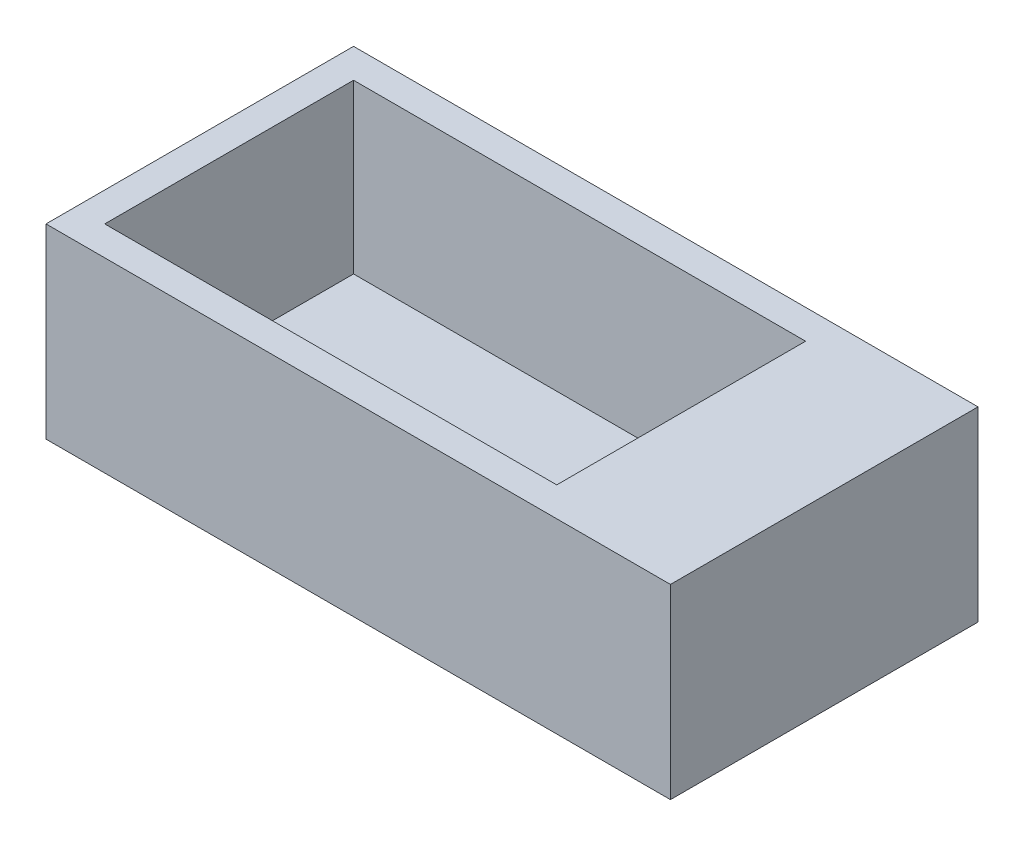
ISO-10303-21;
HEADER;
FILE_DESCRIPTION(('STEP AP214'),'2;1');
FILE_NAME('part.step','',(''),(''),'','','');
FILE_SCHEMA(('AUTOMOTIVE_DESIGN { 1 0 10303 214 1 1 1 1 }'));
ENDSEC;
DATA;
#1=APPLICATION_CONTEXT('core data for automotive mechanical design processes');
#2=APPLICATION_PROTOCOL_DEFINITION('international standard','automotive_design',2000,#1);
#3=PRODUCT_CONTEXT('',#1,'mechanical');
#4=PRODUCT('Part','Part','',(#3));
#5=PRODUCT_RELATED_PRODUCT_CATEGORY('part','',(#4));
#6=PRODUCT_DEFINITION_FORMATION('','',#4);
#7=PRODUCT_DEFINITION_CONTEXT('part definition',#1,'design');
#8=PRODUCT_DEFINITION('design','',#6,#7);
#9=PRODUCT_DEFINITION_SHAPE('','',#8);
#10=(LENGTH_UNIT() NAMED_UNIT(*) SI_UNIT(.MILLI.,.METRE.));
#11=(NAMED_UNIT(*) PLANE_ANGLE_UNIT() SI_UNIT($,.RADIAN.));
#12=(NAMED_UNIT(*) SI_UNIT($,.STERADIAN.) SOLID_ANGLE_UNIT());
#13=UNCERTAINTY_MEASURE_WITH_UNIT(LENGTH_MEASURE(1.E-05),#10,'distance_accuracy_value','');
#14=(GEOMETRIC_REPRESENTATION_CONTEXT(3) GLOBAL_UNCERTAINTY_ASSIGNED_CONTEXT((#13)) GLOBAL_UNIT_ASSIGNED_CONTEXT((#10,
#11,#12)) REPRESENTATION_CONTEXT('',''));
#15=CARTESIAN_POINT('',(0.,0.,0.));
#16=DIRECTION('',(0.,0.,1.));
#17=DIRECTION('',(1.,0.,0.));
#18=AXIS2_PLACEMENT_3D('',#15,#16,#17);
#19=CARTESIAN_POINT('',(0.,20.,16.5));
#20=DIRECTION('',(0.,0.,-1.));
#21=DIRECTION('',(-1.,0.,0.));
#22=AXIS2_PLACEMENT_3D('',#19,#20,#21);
#23=PLANE('',#22);
#24=DIRECTION('',(1.,0.,0.));
#25=VECTOR('',#24,1.);
#26=CARTESIAN_POINT('',(0.,0.,16.5));
#27=LINE('',#26,#25);
#28=CARTESIAN_POINT('',(-33.5,0.,16.5));
#29=VERTEX_POINT('',#28);
#30=CARTESIAN_POINT('',(33.5,0.,16.5));
#31=VERTEX_POINT('',#30);
#32=EDGE_CURVE('E138',#29,#31,#27,.T.);
#33=ORIENTED_EDGE('',*,*,#32,.T.);
#34=DIRECTION('',(0.,-1.,0.));
#35=VECTOR('',#34,1.);
#36=CARTESIAN_POINT('',(33.5,20.,16.5));
#37=LINE('',#36,#35);
#38=CARTESIAN_POINT('',(33.5,20.,16.5));
#39=VERTEX_POINT('',#38);
#40=EDGE_CURVE('E49',#39,#31,#37,.T.);
#41=ORIENTED_EDGE('',*,*,#40,.F.);
#42=DIRECTION('',(1.,0.,0.));
#43=VECTOR('',#42,1.);
#44=CARTESIAN_POINT('',(0.,20.,16.5));
#45=LINE('',#44,#43);
#46=CARTESIAN_POINT('',(-33.5,20.,16.5));
#47=VERTEX_POINT('',#46);
#48=EDGE_CURVE('E117',#47,#39,#45,.T.);
#49=ORIENTED_EDGE('',*,*,#48,.F.);
#50=DIRECTION('',(0.,-1.,0.));
#51=VECTOR('',#50,1.);
#52=CARTESIAN_POINT('',(-33.5,20.,16.5));
#53=LINE('',#52,#51);
#54=EDGE_CURVE('E65',#47,#29,#53,.T.);
#55=ORIENTED_EDGE('',*,*,#54,.T.);
#56=EDGE_LOOP('',(#33,#41,#49,#55));
#57=FACE_BOUND('',#56,.T.);
#58=ADVANCED_FACE('F41',(#57),#23,.F.);
#59=CARTESIAN_POINT('',(33.5,20.,0.));
#60=DIRECTION('',(-1.,0.,0.));
#61=DIRECTION('',(0.,0.,1.));
#62=AXIS2_PLACEMENT_3D('',#59,#60,#61);
#63=PLANE('',#62);
#64=DIRECTION('',(0.,0.,-1.));
#65=VECTOR('',#64,1.);
#66=CARTESIAN_POINT('',(33.5,0.,0.));
#67=LINE('',#66,#65);
#68=CARTESIAN_POINT('',(33.5,0.,-16.5));
#69=VERTEX_POINT('',#68);
#70=EDGE_CURVE('E125',#31,#69,#67,.T.);
#71=ORIENTED_EDGE('',*,*,#70,.T.);
#72=DIRECTION('',(0.,-1.,0.));
#73=VECTOR('',#72,1.);
#74=CARTESIAN_POINT('',(33.5,20.,-16.5));
#75=LINE('',#74,#73);
#76=CARTESIAN_POINT('',(33.5,20.,-16.5));
#77=VERTEX_POINT('',#76);
#78=EDGE_CURVE('E123',#77,#69,#75,.T.);
#79=ORIENTED_EDGE('',*,*,#78,.F.);
#80=DIRECTION('',(0.,0.,-1.));
#81=VECTOR('',#80,1.);
#82=CARTESIAN_POINT('',(33.5,20.,0.));
#83=LINE('',#82,#81);
#84=EDGE_CURVE('E111',#39,#77,#83,.T.);
#85=ORIENTED_EDGE('',*,*,#84,.F.);
#86=ORIENTED_EDGE('',*,*,#40,.T.);
#87=EDGE_LOOP('',(#71,#79,#85,#86));
#88=FACE_BOUND('',#87,.T.);
#89=ADVANCED_FACE('F124',(#88),#63,.F.);
#90=CARTESIAN_POINT('',(0.,20.,-16.5));
#91=DIRECTION('',(0.,0.,-1.));
#92=DIRECTION('',(-1.,0.,0.));
#93=AXIS2_PLACEMENT_3D('',#90,#91,#92);
#94=PLANE('',#93);
#95=DIRECTION('',(1.,0.,0.));
#96=VECTOR('',#95,1.);
#97=CARTESIAN_POINT('',(0.,0.,-16.5));
#98=LINE('',#97,#96);
#99=CARTESIAN_POINT('',(-33.5,0.,-16.5));
#100=VERTEX_POINT('',#99);
#101=EDGE_CURVE('E141',#100,#69,#98,.T.);
#102=ORIENTED_EDGE('',*,*,#101,.F.);
#103=DIRECTION('',(0.,-1.,0.));
#104=VECTOR('',#103,1.);
#105=CARTESIAN_POINT('',(-33.5,20.,-16.5));
#106=LINE('',#105,#104);
#107=CARTESIAN_POINT('',(-33.5,20.,-16.5));
#108=VERTEX_POINT('',#107);
#109=EDGE_CURVE('E129',#108,#100,#106,.T.);
#110=ORIENTED_EDGE('',*,*,#109,.F.);
#111=DIRECTION('',(1.,0.,0.));
#112=VECTOR('',#111,1.);
#113=CARTESIAN_POINT('',(0.,20.,-16.5));
#114=LINE('',#113,#112);
#115=EDGE_CURVE('E116',#108,#77,#114,.T.);
#116=ORIENTED_EDGE('',*,*,#115,.T.);
#117=ORIENTED_EDGE('',*,*,#78,.T.);
#118=EDGE_LOOP('',(#102,#110,#116,#117));
#119=FACE_BOUND('',#118,.T.);
#120=ADVANCED_FACE('F131',(#119),#94,.T.);
#121=CARTESIAN_POINT('',(0.,20.,-13.35));
#122=DIRECTION('',(0.,0.,-1.));
#123=DIRECTION('',(-1.,0.,0.));
#124=AXIS2_PLACEMENT_3D('',#121,#122,#123);
#125=PLANE('',#124);
#126=DIRECTION('',(0.,-1.,0.));
#127=VECTOR('',#126,1.);
#128=CARTESIAN_POINT('',(-30.35,20.,-13.35));
#129=LINE('',#128,#127);
#130=CARTESIAN_POINT('',(-30.35,20.,-13.35));
#131=VERTEX_POINT('',#130);
#132=CARTESIAN_POINT('',(-30.35,2.,-13.35));
#133=VERTEX_POINT('',#132);
#134=EDGE_CURVE('E134',#131,#133,#129,.T.);
#135=ORIENTED_EDGE('',*,*,#134,.T.);
#136=DIRECTION('',(-1.,0.,0.));
#137=VECTOR('',#136,1.);
#138=CARTESIAN_POINT('',(-30.35,2.,-13.35));
#139=LINE('',#138,#137);
#140=CARTESIAN_POINT('',(18.15,2.,-13.35));
#141=VERTEX_POINT('',#140);
#142=EDGE_CURVE('E56',#141,#133,#139,.T.);
#143=ORIENTED_EDGE('',*,*,#142,.F.);
#144=DIRECTION('',(0.,-1.,0.));
#145=VECTOR('',#144,1.);
#146=CARTESIAN_POINT('',(18.15,20.,-13.35));
#147=LINE('',#146,#145);
#148=CARTESIAN_POINT('',(18.15,20.,-13.35));
#149=VERTEX_POINT('',#148);
#150=EDGE_CURVE('E148',#149,#141,#147,.T.);
#151=ORIENTED_EDGE('',*,*,#150,.F.);
#152=DIRECTION('',(1.,0.,0.));
#153=VECTOR('',#152,1.);
#154=CARTESIAN_POINT('',(0.,20.,-13.35));
#155=LINE('',#154,#153);
#156=EDGE_CURVE('E146',#131,#149,#155,.T.);
#157=ORIENTED_EDGE('',*,*,#156,.F.);
#158=EDGE_LOOP('',(#135,#143,#151,#157));
#159=FACE_BOUND('',#158,.T.);
#160=ADVANCED_FACE('F43',(#159),#125,.F.);
#161=CARTESIAN_POINT('',(18.15,20.,0.));
#162=DIRECTION('',(1.,0.,0.));
#163=DIRECTION('',(0.,0.,-1.));
#164=AXIS2_PLACEMENT_3D('',#161,#162,#163);
#165=PLANE('',#164);
#166=CARTESIAN_POINT('',(18.15,10.75,6.35000000000001));
#167=DIRECTION('',(1.,0.,0.));
#168=DIRECTION('',(0.,0.,-1.));
#169=AXIS2_PLACEMENT_3D('',#166,#167,#168);
#170=CIRCLE('',#169,2.83);
#171=CARTESIAN_POINT('',(18.15,10.75,3.52000000000001));
#172=VERTEX_POINT('',#171);
#173=EDGE_CURVE('E198',#172,#172,#170,.T.);
#174=ORIENTED_EDGE('',*,*,#173,.T.);
#175=EDGE_LOOP('',(#174));
#176=FACE_BOUND('',#175,.T.);
#177=CARTESIAN_POINT('',(18.15,10.75,-6.34999999999999));
#178=DIRECTION('',(1.,0.,0.));
#179=DIRECTION('',(0.,0.,-1.));
#180=AXIS2_PLACEMENT_3D('',#177,#178,#179);
#181=CIRCLE('',#180,3.9);
#182=CARTESIAN_POINT('',(18.15,10.75,-10.25));
#183=VERTEX_POINT('',#182);
#184=EDGE_CURVE('E189',#183,#183,#181,.T.);
#185=ORIENTED_EDGE('',*,*,#184,.T.);
#186=EDGE_LOOP('',(#185));
#187=FACE_BOUND('',#186,.T.);
#188=ORIENTED_EDGE('',*,*,#150,.T.);
#189=DIRECTION('',(0.,0.,-1.));
#190=VECTOR('',#189,1.);
#191=CARTESIAN_POINT('',(18.15,2.,-13.35));
#192=LINE('',#191,#190);
#193=CARTESIAN_POINT('',(18.15,2.,13.35));
#194=VERTEX_POINT('',#193);
#195=EDGE_CURVE('E162',#194,#141,#192,.T.);
#196=ORIENTED_EDGE('',*,*,#195,.F.);
#197=DIRECTION('',(0.,-1.,0.));
#198=VECTOR('',#197,1.);
#199=CARTESIAN_POINT('',(18.15,20.,13.35));
#200=LINE('',#199,#198);
#201=CARTESIAN_POINT('',(18.15,20.,13.35));
#202=VERTEX_POINT('',#201);
#203=EDGE_CURVE('E156',#202,#194,#200,.T.);
#204=ORIENTED_EDGE('',*,*,#203,.F.);
#205=DIRECTION('',(0.,0.,1.));
#206=VECTOR('',#205,1.);
#207=CARTESIAN_POINT('',(18.15,20.,0.));
#208=LINE('',#207,#206);
#209=EDGE_CURVE('E93',#149,#202,#208,.T.);
#210=ORIENTED_EDGE('',*,*,#209,.F.);
#211=EDGE_LOOP('',(#188,#196,#204,#210));
#212=FACE_BOUND('',#211,.T.);
#213=ADVANCED_FACE('F160',(#176,#187,#212),#165,.F.);
#214=CARTESIAN_POINT('',(0.,20.,13.35));
#215=DIRECTION('',(0.,0.,-1.));
#216=DIRECTION('',(-1.,0.,0.));
#217=AXIS2_PLACEMENT_3D('',#214,#215,#216);
#218=PLANE('',#217);
#219=DIRECTION('',(1.,0.,0.));
#220=VECTOR('',#219,1.);
#221=CARTESIAN_POINT('',(-30.35,2.,13.35));
#222=LINE('',#221,#220);
#223=CARTESIAN_POINT('',(-30.35,2.,13.35));
#224=VERTEX_POINT('',#223);
#225=EDGE_CURVE('E167',#224,#194,#222,.T.);
#226=ORIENTED_EDGE('',*,*,#225,.F.);
#227=DIRECTION('',(0.,-1.,0.));
#228=VECTOR('',#227,1.);
#229=CARTESIAN_POINT('',(-30.35,20.,13.35));
#230=LINE('',#229,#228);
#231=CARTESIAN_POINT('',(-30.35,20.,13.35));
#232=VERTEX_POINT('',#231);
#233=EDGE_CURVE('E153',#232,#224,#230,.T.);
#234=ORIENTED_EDGE('',*,*,#233,.F.);
#235=DIRECTION('',(1.,0.,0.));
#236=VECTOR('',#235,1.);
#237=CARTESIAN_POINT('',(0.,20.,13.35));
#238=LINE('',#237,#236);
#239=EDGE_CURVE('E173',#232,#202,#238,.T.);
#240=ORIENTED_EDGE('',*,*,#239,.T.);
#241=ORIENTED_EDGE('',*,*,#203,.T.);
#242=EDGE_LOOP('',(#226,#234,#240,#241));
#243=FACE_BOUND('',#242,.T.);
#244=ADVANCED_FACE('F226',(#243),#218,.T.);
#245=CARTESIAN_POINT('',(-30.35,20.,0.));
#246=DIRECTION('',(-1.,0.,0.));
#247=DIRECTION('',(0.,0.,1.));
#248=AXIS2_PLACEMENT_3D('',#245,#246,#247);
#249=PLANE('',#248);
#250=ORIENTED_EDGE('',*,*,#233,.T.);
#251=DIRECTION('',(0.,0.,1.));
#252=VECTOR('',#251,1.);
#253=CARTESIAN_POINT('',(-30.35,2.,-13.35));
#254=LINE('',#253,#252);
#255=EDGE_CURVE('E182',#133,#224,#254,.T.);
#256=ORIENTED_EDGE('',*,*,#255,.F.);
#257=ORIENTED_EDGE('',*,*,#134,.F.);
#258=DIRECTION('',(0.,0.,-1.));
#259=VECTOR('',#258,1.);
#260=CARTESIAN_POINT('',(-30.35,20.,0.));
#261=LINE('',#260,#259);
#262=EDGE_CURVE('E176',#232,#131,#261,.T.);
#263=ORIENTED_EDGE('',*,*,#262,.F.);
#264=EDGE_LOOP('',(#250,#256,#257,#263));
#265=FACE_BOUND('',#264,.T.);
#266=ADVANCED_FACE('F181',(#265),#249,.F.);
#267=CARTESIAN_POINT('',(-33.5,20.,0.));
#268=DIRECTION('',(-1.,0.,0.));
#269=DIRECTION('',(0.,0.,1.));
#270=AXIS2_PLACEMENT_3D('',#267,#268,#269);
#271=PLANE('',#270);
#272=DIRECTION('',(0.,0.,-1.));
#273=VECTOR('',#272,1.);
#274=CARTESIAN_POINT('',(-33.5,0.,0.));
#275=LINE('',#274,#273);
#276=EDGE_CURVE('E143',#29,#100,#275,.T.);
#277=ORIENTED_EDGE('',*,*,#276,.F.);
#278=ORIENTED_EDGE('',*,*,#54,.F.);
#279=DIRECTION('',(0.,0.,-1.));
#280=VECTOR('',#279,1.);
#281=CARTESIAN_POINT('',(-33.5,20.,0.));
#282=LINE('',#281,#280);
#283=EDGE_CURVE('E132',#47,#108,#282,.T.);
#284=ORIENTED_EDGE('',*,*,#283,.T.);
#285=ORIENTED_EDGE('',*,*,#109,.T.);
#286=EDGE_LOOP('',(#277,#278,#284,#285));
#287=FACE_BOUND('',#286,.T.);
#288=ADVANCED_FACE('F225',(#287),#271,.T.);
#289=CARTESIAN_POINT('',(0.,20.,0.));
#290=DIRECTION('',(0.,1.,0.));
#291=DIRECTION('',(0.,0.,1.));
#292=AXIS2_PLACEMENT_3D('',#289,#290,#291);
#293=PLANE('',#292);
#294=ORIENTED_EDGE('',*,*,#156,.T.);
#295=ORIENTED_EDGE('',*,*,#209,.T.);
#296=ORIENTED_EDGE('',*,*,#239,.F.);
#297=ORIENTED_EDGE('',*,*,#262,.T.);
#298=EDGE_LOOP('',(#294,#295,#296,#297));
#299=FACE_BOUND('',#298,.T.);
#300=ORIENTED_EDGE('',*,*,#48,.T.);
#301=ORIENTED_EDGE('',*,*,#84,.T.);
#302=ORIENTED_EDGE('',*,*,#115,.F.);
#303=ORIENTED_EDGE('',*,*,#283,.F.);
#304=EDGE_LOOP('',(#300,#301,#302,#303));
#305=FACE_BOUND('',#304,.T.);
#306=ADVANCED_FACE('F113',(#299,#305),#293,.T.);
#307=CARTESIAN_POINT('',(0.,0.,0.));
#308=DIRECTION('',(0.,1.,0.));
#309=DIRECTION('',(0.,0.,1.));
#310=AXIS2_PLACEMENT_3D('',#307,#308,#309);
#311=PLANE('',#310);
#312=ORIENTED_EDGE('',*,*,#32,.F.);
#313=ORIENTED_EDGE('',*,*,#276,.T.);
#314=ORIENTED_EDGE('',*,*,#101,.T.);
#315=ORIENTED_EDGE('',*,*,#70,.F.);
#316=EDGE_LOOP('',(#312,#313,#314,#315));
#317=FACE_BOUND('',#316,.T.);
#318=ADVANCED_FACE('F260',(#317),#311,.F.);
#319=CARTESIAN_POINT('',(0.,2.,0.));
#320=DIRECTION('',(0.,1.,0.));
#321=DIRECTION('',(0.,0.,1.));
#322=AXIS2_PLACEMENT_3D('',#319,#320,#321);
#323=PLANE('',#322);
#324=ORIENTED_EDGE('',*,*,#255,.T.);
#325=ORIENTED_EDGE('',*,*,#225,.T.);
#326=ORIENTED_EDGE('',*,*,#195,.T.);
#327=ORIENTED_EDGE('',*,*,#142,.T.);
#328=EDGE_LOOP('',(#324,#325,#326,#327));
#329=FACE_BOUND('',#328,.T.);
#330=ADVANCED_FACE('F256',(#329),#323,.T.);
#331=CARTESIAN_POINT('',(16.15,10.75,-6.34999999999999));
#332=DIRECTION('',(1.,0.,0.));
#333=DIRECTION('',(0.,0.,-1.));
#334=AXIS2_PLACEMENT_3D('',#331,#332,#333);
#335=CYLINDRICAL_SURFACE('',#334,3.9);
#336=CARTESIAN_POINT('',(16.15,10.75,-6.34999999999999));
#337=DIRECTION('',(1.,0.,0.));
#338=DIRECTION('',(0.,0.,-1.));
#339=AXIS2_PLACEMENT_3D('',#336,#337,#338);
#340=CIRCLE('',#339,3.9);
#341=CARTESIAN_POINT('',(16.15,10.75,-10.25));
#342=VERTEX_POINT('',#341);
#343=EDGE_CURVE('E186',#342,#342,#340,.T.);
#344=ORIENTED_EDGE('',*,*,#343,.T.);
#345=EDGE_LOOP('',(#344));
#346=FACE_BOUND('',#345,.T.);
#347=ORIENTED_EDGE('',*,*,#184,.F.);
#348=EDGE_LOOP('',(#347));
#349=FACE_BOUND('',#348,.T.);
#350=ADVANCED_FACE('F249',(#346,#349),#335,.T.);
#351=CARTESIAN_POINT('',(16.15,10.75,-6.34999999999999));
#352=DIRECTION('',(1.,0.,0.));
#353=DIRECTION('',(0.,0.,-1.));
#354=AXIS2_PLACEMENT_3D('',#351,#352,#353);
#355=PLANE('',#354);
#356=CARTESIAN_POINT('',(16.15,10.75,-6.34999999999999));
#357=DIRECTION('',(1.,0.,0.));
#358=DIRECTION('',(0.,0.,-1.));
#359=AXIS2_PLACEMENT_3D('',#356,#357,#358);
#360=CIRCLE('',#359,2.83);
#361=CARTESIAN_POINT('',(16.15,10.75,-9.17999999999999));
#362=VERTEX_POINT('',#361);
#363=EDGE_CURVE('E193',#362,#362,#360,.T.);
#364=ORIENTED_EDGE('',*,*,#363,.T.);
#365=EDGE_LOOP('',(#364));
#366=FACE_BOUND('',#365,.T.);
#367=ORIENTED_EDGE('',*,*,#343,.F.);
#368=EDGE_LOOP('',(#367));
#369=FACE_BOUND('',#368,.T.);
#370=ADVANCED_FACE('F241',(#366,#369),#355,.F.);
#371=CARTESIAN_POINT('',(16.15,10.75,-6.34999999999999));
#372=DIRECTION('',(1.,0.,0.));
#373=DIRECTION('',(0.,0.,-1.));
#374=AXIS2_PLACEMENT_3D('',#371,#372,#373);
#375=CYLINDRICAL_SURFACE('',#374,2.83);
#376=ORIENTED_EDGE('',*,*,#363,.F.);
#377=EDGE_LOOP('',(#376));
#378=FACE_BOUND('',#377,.T.);
#379=CARTESIAN_POINT('',(18.15,10.75,-6.34999999999999));
#380=DIRECTION('',(1.,0.,0.));
#381=DIRECTION('',(0.,0.,-1.));
#382=AXIS2_PLACEMENT_3D('',#379,#380,#381);
#383=CIRCLE('',#382,2.83);
#384=CARTESIAN_POINT('',(18.15,10.75,-9.17999999999999));
#385=VERTEX_POINT('',#384);
#386=EDGE_CURVE('E12',#385,#385,#383,.T.);
#387=ORIENTED_EDGE('',*,*,#386,.T.);
#388=EDGE_LOOP('',(#387));
#389=FACE_BOUND('',#388,.T.);
#390=ADVANCED_FACE('F236',(#378,#389),#375,.F.);
#391=ORIENTED_EDGE('',*,*,#386,.F.);
#392=EDGE_LOOP('',(#391));
#393=FACE_BOUND('',#392,.T.);
#394=ADVANCED_FACE('F213',(#393),#165,.F.);
#395=CARTESIAN_POINT('',(16.15,10.75,6.35000000000001));
#396=DIRECTION('',(1.,0.,0.));
#397=DIRECTION('',(0.,0.,-1.));
#398=AXIS2_PLACEMENT_3D('',#395,#396,#397);
#399=CYLINDRICAL_SURFACE('',#398,2.83);
#400=CARTESIAN_POINT('',(16.15,10.75,6.35000000000001));
#401=DIRECTION('',(1.,0.,0.));
#402=DIRECTION('',(0.,0.,-1.));
#403=AXIS2_PLACEMENT_3D('',#400,#401,#402);
#404=CIRCLE('',#403,2.83);
#405=CARTESIAN_POINT('',(16.15,10.75,3.52000000000001));
#406=VERTEX_POINT('',#405);
#407=EDGE_CURVE('E197',#406,#406,#404,.T.);
#408=ORIENTED_EDGE('',*,*,#407,.T.);
#409=EDGE_LOOP('',(#408));
#410=FACE_BOUND('',#409,.T.);
#411=ORIENTED_EDGE('',*,*,#173,.F.);
#412=EDGE_LOOP('',(#411));
#413=FACE_BOUND('',#412,.T.);
#414=ADVANCED_FACE('F204',(#410,#413),#399,.T.);
#415=CARTESIAN_POINT('',(16.15,10.75,6.35000000000001));
#416=DIRECTION('',(1.,0.,0.));
#417=DIRECTION('',(0.,0.,-1.));
#418=AXIS2_PLACEMENT_3D('',#415,#416,#417);
#419=PLANE('',#418);
#420=ORIENTED_EDGE('',*,*,#407,.F.);
#421=EDGE_LOOP('',(#420));
#422=FACE_BOUND('',#421,.T.);
#423=ADVANCED_FACE('F207',(#422),#419,.F.);
#424=CLOSED_SHELL('',(#58,#89,#120,#160,#213,#244,#266,#288,#306,#318,#330,#350,#370,#390,#394,
#414,#423));
#425=MANIFOLD_SOLID_BREP('B2',#424);
#426=ADVANCED_BREP_SHAPE_REPRESENTATION('',(#18,#425),#14);
#427=SHAPE_DEFINITION_REPRESENTATION(#9,#426);
ENDSEC;
END-ISO-10303-21;
